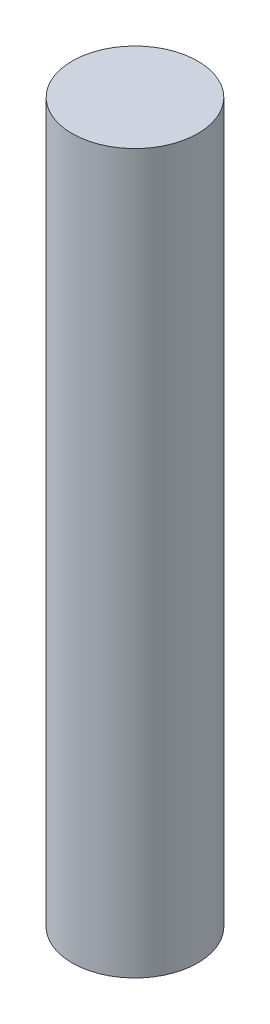
ISO-10303-21;
HEADER;
FILE_DESCRIPTION(('STEP AP214'),'2;1');
FILE_NAME('part.step','',(''),(''),'','','');
FILE_SCHEMA(('AUTOMOTIVE_DESIGN { 1 0 10303 214 1 1 1 1 }'));
ENDSEC;
DATA;
#1=APPLICATION_CONTEXT('core data for automotive mechanical design processes');
#2=APPLICATION_PROTOCOL_DEFINITION('international standard','automotive_design',2000,#1);
#3=PRODUCT_CONTEXT('',#1,'mechanical');
#4=PRODUCT('Part','Part','',(#3));
#5=PRODUCT_RELATED_PRODUCT_CATEGORY('part','',(#4));
#6=PRODUCT_DEFINITION_FORMATION('','',#4);
#7=PRODUCT_DEFINITION_CONTEXT('part definition',#1,'design');
#8=PRODUCT_DEFINITION('design','',#6,#7);
#9=PRODUCT_DEFINITION_SHAPE('','',#8);
#10=(LENGTH_UNIT() NAMED_UNIT(*) SI_UNIT(.MILLI.,.METRE.));
#11=(NAMED_UNIT(*) PLANE_ANGLE_UNIT() SI_UNIT($,.RADIAN.));
#12=(NAMED_UNIT(*) SI_UNIT($,.STERADIAN.) SOLID_ANGLE_UNIT());
#13=UNCERTAINTY_MEASURE_WITH_UNIT(LENGTH_MEASURE(1.E-05),#10,'distance_accuracy_value','');
#14=(GEOMETRIC_REPRESENTATION_CONTEXT(3) GLOBAL_UNCERTAINTY_ASSIGNED_CONTEXT((#13)) GLOBAL_UNIT_ASSIGNED_CONTEXT((#10,
#11,#12)) REPRESENTATION_CONTEXT('',''));
#15=CARTESIAN_POINT('',(0.,0.,0.));
#16=DIRECTION('',(0.,0.,1.));
#17=DIRECTION('',(1.,0.,0.));
#18=AXIS2_PLACEMENT_3D('',#15,#16,#17);
#19=CARTESIAN_POINT('',(0.,57.15,0.));
#20=DIRECTION('',(0.,-1.,0.));
#21=DIRECTION('',(0.,0.,-1.));
#22=AXIS2_PLACEMENT_3D('',#19,#20,#21);
#23=CYLINDRICAL_SURFACE('',#22,5.);
#24=CARTESIAN_POINT('',(0.,57.15,0.));
#25=DIRECTION('',(0.,1.,0.));
#26=DIRECTION('',(0.,0.,1.));
#27=AXIS2_PLACEMENT_3D('',#24,#25,#26);
#28=CIRCLE('',#27,5.);
#29=CARTESIAN_POINT('',(0.,57.15,5.));
#30=VERTEX_POINT('',#29);
#31=EDGE_CURVE('E10',#30,#30,#28,.T.);
#32=ORIENTED_EDGE('',*,*,#31,.F.);
#33=EDGE_LOOP('',(#32));
#34=FACE_BOUND('',#33,.T.);
#35=CARTESIAN_POINT('',(0.,0.,0.));
#36=DIRECTION('',(0.,1.,0.));
#37=DIRECTION('',(0.,0.,1.));
#38=AXIS2_PLACEMENT_3D('',#35,#36,#37);
#39=CIRCLE('',#38,5.);
#40=CARTESIAN_POINT('',(0.,0.,5.));
#41=VERTEX_POINT('',#40);
#42=EDGE_CURVE('E40',#41,#41,#39,.T.);
#43=ORIENTED_EDGE('',*,*,#42,.T.);
#44=EDGE_LOOP('',(#43));
#45=FACE_BOUND('',#44,.T.);
#46=ADVANCED_FACE('F37',(#34,#45),#23,.T.);
#47=CARTESIAN_POINT('',(0.,57.15,0.));
#48=DIRECTION('',(0.,1.,0.));
#49=DIRECTION('',(0.,0.,1.));
#50=AXIS2_PLACEMENT_3D('',#47,#48,#49);
#51=PLANE('',#50);
#52=ORIENTED_EDGE('',*,*,#31,.T.);
#53=EDGE_LOOP('',(#52));
#54=FACE_BOUND('',#53,.T.);
#55=ADVANCED_FACE('F54',(#54),#51,.T.);
#56=CARTESIAN_POINT('',(0.,0.,0.));
#57=DIRECTION('',(0.,1.,0.));
#58=DIRECTION('',(0.,0.,1.));
#59=AXIS2_PLACEMENT_3D('',#56,#57,#58);
#60=PLANE('',#59);
#61=ORIENTED_EDGE('',*,*,#42,.F.);
#62=EDGE_LOOP('',(#61));
#63=FACE_BOUND('',#62,.T.);
#64=ADVANCED_FACE('F52',(#63),#60,.F.);
#65=CLOSED_SHELL('',(#46,#55,#64));
#66=MANIFOLD_SOLID_BREP('B2',#65);
#67=ADVANCED_BREP_SHAPE_REPRESENTATION('',(#18,#66),#14);
#68=SHAPE_DEFINITION_REPRESENTATION(#9,#67);
ENDSEC;
END-ISO-10303-21;
